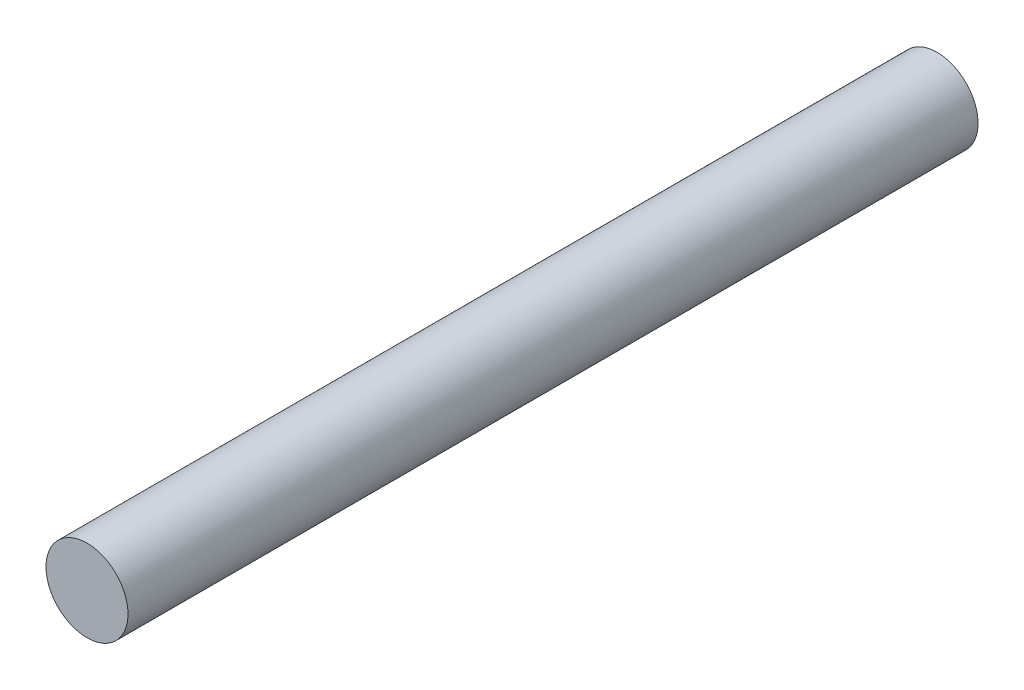
ISO-10303-21;
HEADER;
FILE_DESCRIPTION(('STEP AP214'),'2;1');
FILE_NAME('part.step','',(''),(''),'','','');
FILE_SCHEMA(('AUTOMOTIVE_DESIGN { 1 0 10303 214 1 1 1 1 }'));
ENDSEC;
DATA;
#1=APPLICATION_CONTEXT('core data for automotive mechanical design processes');
#2=APPLICATION_PROTOCOL_DEFINITION('international standard','automotive_design',2000,#1);
#3=PRODUCT_CONTEXT('',#1,'mechanical');
#4=PRODUCT('Part','Part','',(#3));
#5=PRODUCT_RELATED_PRODUCT_CATEGORY('part','',(#4));
#6=PRODUCT_DEFINITION_FORMATION('','',#4);
#7=PRODUCT_DEFINITION_CONTEXT('part definition',#1,'design');
#8=PRODUCT_DEFINITION('design','',#6,#7);
#9=PRODUCT_DEFINITION_SHAPE('','',#8);
#10=(LENGTH_UNIT() NAMED_UNIT(*) SI_UNIT(.MILLI.,.METRE.));
#11=(NAMED_UNIT(*) PLANE_ANGLE_UNIT() SI_UNIT($,.RADIAN.));
#12=(NAMED_UNIT(*) SI_UNIT($,.STERADIAN.) SOLID_ANGLE_UNIT());
#13=UNCERTAINTY_MEASURE_WITH_UNIT(LENGTH_MEASURE(1.E-05),#10,'distance_accuracy_value','');
#14=(GEOMETRIC_REPRESENTATION_CONTEXT(3) GLOBAL_UNCERTAINTY_ASSIGNED_CONTEXT((#13)) GLOBAL_UNIT_ASSIGNED_CONTEXT((#10,
#11,#12)) REPRESENTATION_CONTEXT('',''));
#15=CARTESIAN_POINT('',(0.,0.,0.));
#16=DIRECTION('',(0.,0.,1.));
#17=DIRECTION('',(1.,0.,0.));
#18=AXIS2_PLACEMENT_3D('',#15,#16,#17);
#19=CARTESIAN_POINT('',(0.,0.,57.));
#20=DIRECTION('',(0.,0.,-1.));
#21=DIRECTION('',(-1.,0.,0.));
#22=AXIS2_PLACEMENT_3D('',#19,#20,#21);
#23=CYLINDRICAL_SURFACE('',#22,2.75);
#24=CARTESIAN_POINT('',(0.,0.,57.));
#25=DIRECTION('',(0.,0.,1.));
#26=DIRECTION('',(1.,0.,0.));
#27=AXIS2_PLACEMENT_3D('',#24,#25,#26);
#28=CIRCLE('',#27,2.75);
#29=CARTESIAN_POINT('',(-2.75,0.,57.));
#30=VERTEX_POINT('',#29);
#31=EDGE_CURVE('E10',#30,#30,#28,.T.);
#32=CARTESIAN_POINT('',(0.,0.,0.));
#33=DIRECTION('',(0.,0.,1.));
#34=DIRECTION('',(1.,0.,0.));
#35=AXIS2_PLACEMENT_3D('',#32,#33,#34);
#36=CIRCLE('',#35,2.75);
#37=CARTESIAN_POINT('',(-2.75,0.,0.));
#38=VERTEX_POINT('',#37);
#39=EDGE_CURVE('E35',#38,#38,#36,.T.);
#40=CARTESIAN_POINT('',(-2.75,0.,57.));
#41=CARTESIAN_POINT('',(-2.75,0.,56.40625));
#42=CARTESIAN_POINT('',(-2.75,0.,55.8125));
#43=CARTESIAN_POINT('',(-2.75,0.,54.625));
#44=CARTESIAN_POINT('',(-2.75,0.,54.03125));
#45=CARTESIAN_POINT('',(-2.75,0.,52.84375));
#46=CARTESIAN_POINT('',(-2.75,0.,52.25));
#47=CARTESIAN_POINT('',(-2.75,0.,51.0625));
#48=CARTESIAN_POINT('',(-2.75,0.,50.46875));
#49=CARTESIAN_POINT('',(-2.75,0.,49.28125));
#50=CARTESIAN_POINT('',(-2.75,0.,48.6875));
#51=CARTESIAN_POINT('',(-2.75,0.,47.5));
#52=CARTESIAN_POINT('',(-2.75,0.,46.90625));
#53=CARTESIAN_POINT('',(-2.75,0.,45.71875));
#54=CARTESIAN_POINT('',(-2.75,0.,45.125));
#55=CARTESIAN_POINT('',(-2.75,0.,43.9375));
#56=CARTESIAN_POINT('',(-2.75,0.,43.34375));
#57=CARTESIAN_POINT('',(-2.75,0.,42.15625));
#58=CARTESIAN_POINT('',(-2.75,0.,41.5625));
#59=CARTESIAN_POINT('',(-2.75,0.,40.375));
#60=CARTESIAN_POINT('',(-2.75,0.,39.78125));
#61=CARTESIAN_POINT('',(-2.75,0.,38.59375));
#62=CARTESIAN_POINT('',(-2.75,0.,38.));
#63=CARTESIAN_POINT('',(-2.75,0.,36.8125));
#64=CARTESIAN_POINT('',(-2.75,0.,36.21875));
#65=CARTESIAN_POINT('',(-2.75,0.,35.03125));
#66=CARTESIAN_POINT('',(-2.75,0.,34.4375));
#67=CARTESIAN_POINT('',(-2.75,0.,33.25));
#68=CARTESIAN_POINT('',(-2.75,0.,32.65625));
#69=CARTESIAN_POINT('',(-2.75,0.,31.46875));
#70=CARTESIAN_POINT('',(-2.75,0.,30.875));
#71=CARTESIAN_POINT('',(-2.75,0.,29.6875));
#72=CARTESIAN_POINT('',(-2.75,0.,29.09375));
#73=CARTESIAN_POINT('',(-2.75,0.,27.90625));
#74=CARTESIAN_POINT('',(-2.75,0.,27.3125));
#75=CARTESIAN_POINT('',(-2.75,0.,26.125));
#76=CARTESIAN_POINT('',(-2.75,0.,25.53125));
#77=CARTESIAN_POINT('',(-2.75,0.,24.34375));
#78=CARTESIAN_POINT('',(-2.75,0.,23.75));
#79=CARTESIAN_POINT('',(-2.75,0.,22.5625));
#80=CARTESIAN_POINT('',(-2.75,0.,21.96875));
#81=CARTESIAN_POINT('',(-2.75,0.,20.78125));
#82=CARTESIAN_POINT('',(-2.75,0.,20.1875));
#83=CARTESIAN_POINT('',(-2.75,0.,19.));
#84=CARTESIAN_POINT('',(-2.75,0.,18.40625));
#85=CARTESIAN_POINT('',(-2.75,0.,17.21875));
#86=CARTESIAN_POINT('',(-2.75,0.,16.625));
#87=CARTESIAN_POINT('',(-2.75,0.,15.4375));
#88=CARTESIAN_POINT('',(-2.75,0.,14.84375));
#89=CARTESIAN_POINT('',(-2.75,0.,13.65625));
#90=CARTESIAN_POINT('',(-2.75,0.,13.0625));
#91=CARTESIAN_POINT('',(-2.75,0.,11.875));
#92=CARTESIAN_POINT('',(-2.75,0.,11.28125));
#93=CARTESIAN_POINT('',(-2.75,0.,10.09375));
#94=CARTESIAN_POINT('',(-2.75,0.,9.5));
#95=CARTESIAN_POINT('',(-2.75,0.,8.3125));
#96=CARTESIAN_POINT('',(-2.75,0.,7.71875));
#97=CARTESIAN_POINT('',(-2.75,0.,6.53125));
#98=CARTESIAN_POINT('',(-2.75,0.,5.9375));
#99=CARTESIAN_POINT('',(-2.75,0.,4.75));
#100=CARTESIAN_POINT('',(-2.75,0.,4.15625));
#101=CARTESIAN_POINT('',(-2.75,0.,2.96875));
#102=CARTESIAN_POINT('',(-2.75,0.,2.375));
#103=CARTESIAN_POINT('',(-2.75,0.,1.1875));
#104=CARTESIAN_POINT('',(-2.75,0.,0.593749999999999));
#105=CARTESIAN_POINT('',(-2.75,0.,0.));
#106=B_SPLINE_CURVE_WITH_KNOTS('',3,(#40,#41,#42,#43,#44,#45,#46,#47,#48,#49,#50,#51,#52,#53,
#54,#55,#56,#57,#58,#59,#60,#61,#62,#63,#64,#65,#66,#67,#68,#69,#70,#71,#72,#73,#74,#75,#76,#77,
#78,#79,#80,#81,#82,#83,#84,#85,#86,#87,#88,#89,#90,#91,#92,#93,#94,#95,#96,#97,#98,#99,#100,
#101,#102,#103,#104,#105),.UNSPECIFIED.,.F.,.F.,(4,2,2,2,2,2,2,2,2,2,2,2,2,2,2,2,2,2,2,2,2,2,2,
2,2,2,2,2,2,2,2,2,4),(0.,1.78125000000001,3.5625,5.34375,7.12500000000001,8.90625,10.6875,
12.46875,14.25,16.03125,17.8125,19.59375,21.375,23.15625,24.9375,26.71875,28.5,30.28125,32.0625,
33.84375,35.625,37.40625,39.1875,40.96875,42.75,44.53125,46.3125,48.09375,49.875,51.65625,
53.4375,55.21875,57.),.UNSPECIFIED.);
#107=EDGE_CURVE('BSEAM32',#30,#38,#106,.T.);
#108=ORIENTED_EDGE('',*,*,#31,.F.);
#109=ORIENTED_EDGE('',*,*,#39,.T.);
#110=ORIENTED_EDGE('',*,*,#107,.T.);
#111=ORIENTED_EDGE('',*,*,#107,.F.);
#112=EDGE_LOOP('',(#108,#110,#109,#111));
#113=FACE_BOUND('',#112,.T.);
#114=ADVANCED_FACE('F32',(#113),#23,.T.);
#115=CARTESIAN_POINT('',(0.,0.,57.));
#116=DIRECTION('',(0.,0.,1.));
#117=DIRECTION('',(1.,0.,0.));
#118=AXIS2_PLACEMENT_3D('',#115,#116,#117);
#119=PLANE('',#118);
#120=ORIENTED_EDGE('',*,*,#31,.T.);
#121=EDGE_LOOP('',(#120));
#122=FACE_BOUND('',#121,.T.);
#123=ADVANCED_FACE('F47',(#122),#119,.T.);
#124=CARTESIAN_POINT('',(0.,0.,0.));
#125=DIRECTION('',(0.,0.,1.));
#126=DIRECTION('',(1.,0.,0.));
#127=AXIS2_PLACEMENT_3D('',#124,#125,#126);
#128=PLANE('',#127);
#129=ORIENTED_EDGE('',*,*,#39,.F.);
#130=EDGE_LOOP('',(#129));
#131=FACE_BOUND('',#130,.T.);
#132=ADVANCED_FACE('F45',(#131),#128,.F.);
#133=CLOSED_SHELL('',(#114,#123,#132));
#134=MANIFOLD_SOLID_BREP('B2',#133);
#135=ADVANCED_BREP_SHAPE_REPRESENTATION('',(#18,#134),#14);
#136=SHAPE_DEFINITION_REPRESENTATION(#9,#135);
ENDSEC;
END-ISO-10303-21;
